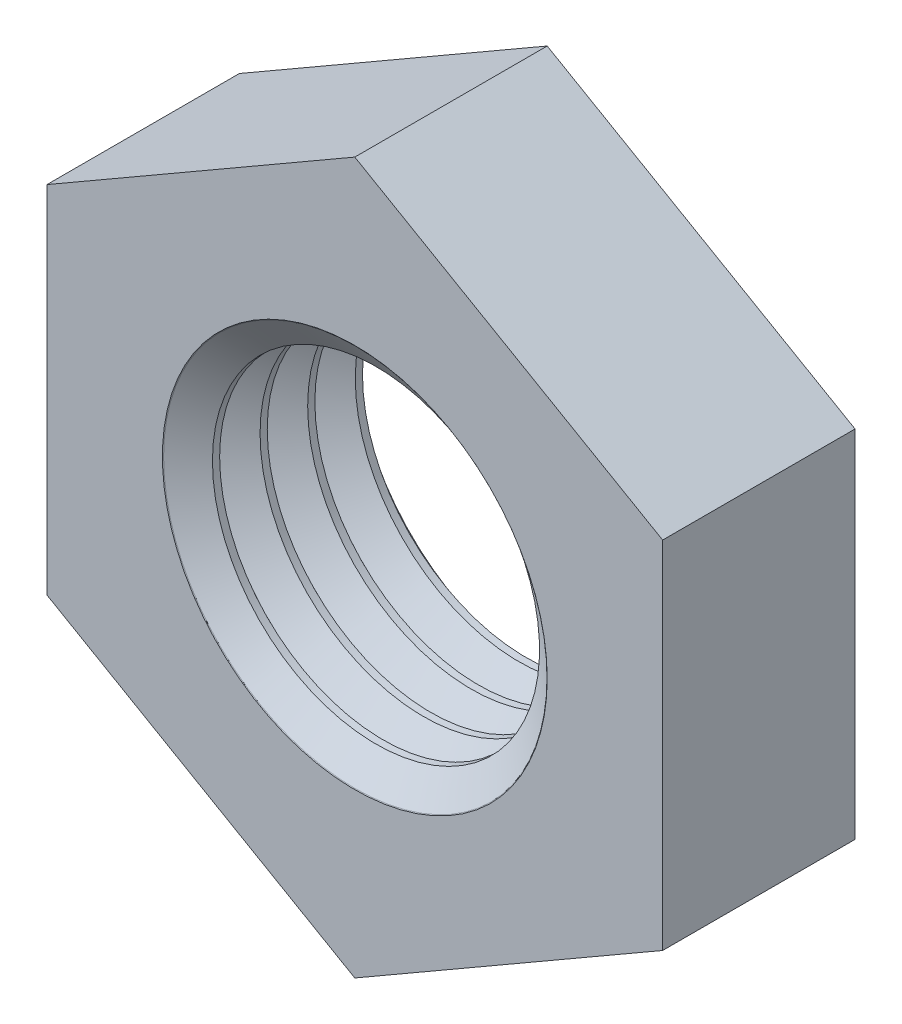
ISO-10303-21;
HEADER;
FILE_DESCRIPTION(('STEP AP214'),'2;1');
FILE_NAME('part.step','',(''),(''),'','','');
FILE_SCHEMA(('AUTOMOTIVE_DESIGN { 1 0 10303 214 1 1 1 1 }'));
ENDSEC;
DATA;
#1=APPLICATION_CONTEXT('core data for automotive mechanical design processes');
#2=APPLICATION_PROTOCOL_DEFINITION('international standard','automotive_design',2000,#1);
#3=PRODUCT_CONTEXT('',#1,'mechanical');
#4=PRODUCT('Part','Part','',(#3));
#5=PRODUCT_RELATED_PRODUCT_CATEGORY('part','',(#4));
#6=PRODUCT_DEFINITION_FORMATION('','',#4);
#7=PRODUCT_DEFINITION_CONTEXT('part definition',#1,'design');
#8=PRODUCT_DEFINITION('design','',#6,#7);
#9=PRODUCT_DEFINITION_SHAPE('','',#8);
#10=(LENGTH_UNIT() NAMED_UNIT(*) SI_UNIT(.MILLI.,.METRE.));
#11=(NAMED_UNIT(*) PLANE_ANGLE_UNIT() SI_UNIT($,.RADIAN.));
#12=(NAMED_UNIT(*) SI_UNIT($,.STERADIAN.) SOLID_ANGLE_UNIT());
#13=UNCERTAINTY_MEASURE_WITH_UNIT(LENGTH_MEASURE(1.E-05),#10,'distance_accuracy_value','');
#14=(GEOMETRIC_REPRESENTATION_CONTEXT(3) GLOBAL_UNCERTAINTY_ASSIGNED_CONTEXT((#13)) GLOBAL_UNIT_ASSIGNED_CONTEXT((#10,
#11,#12)) REPRESENTATION_CONTEXT('',''));
#15=CARTESIAN_POINT('',(0.,0.,0.));
#16=DIRECTION('',(0.,0.,1.));
#17=DIRECTION('',(1.,0.,0.));
#18=AXIS2_PLACEMENT_3D('',#15,#16,#17);
#19=CARTESIAN_POINT('',(0.,0.,-5.));
#20=DIRECTION('',(0.,0.,1.));
#21=DIRECTION('',(1.,0.,0.));
#22=AXIS2_PLACEMENT_3D('',#19,#20,#21);
#23=CYLINDRICAL_SURFACE('',#22,4.25);
#24=CARTESIAN_POINT('',(0.,0.,-4.26245565365729));
#25=DIRECTION('',(0.,0.,-1.));
#26=DIRECTION('',(-1.,0.,0.));
#27=AXIS2_PLACEMENT_3D('',#24,#25,#26);
#28=CIRCLE('',#27,4.25);
#29=CARTESIAN_POINT('',(-4.25,0.,-4.26245565365729));
#30=VERTEX_POINT('',#29);
#31=EDGE_CURVE('E226',#30,#30,#28,.T.);
#32=ORIENTED_EDGE('',*,*,#31,.F.);
#33=EDGE_LOOP('',(#32));
#34=FACE_BOUND('',#33,.T.);
#35=CARTESIAN_POINT('',(0.,0.,-4.44944434634271));
#36=DIRECTION('',(0.,0.,-1.));
#37=DIRECTION('',(-1.,0.,0.));
#38=AXIS2_PLACEMENT_3D('',#35,#36,#37);
#39=CIRCLE('',#38,4.25);
#40=CARTESIAN_POINT('',(-4.25,0.,-4.44944434634271));
#41=VERTEX_POINT('',#40);
#42=EDGE_CURVE('E154',#41,#41,#39,.F.);
#43=ORIENTED_EDGE('',*,*,#42,.F.);
#44=EDGE_LOOP('',(#43));
#45=FACE_BOUND('',#44,.T.);
#46=ADVANCED_FACE('F41',(#34,#45),#23,.F.);
#47=CARTESIAN_POINT('',(0.,0.,-3.21214434634273));
#48=DIRECTION('',(0.,0.,-1.));
#49=DIRECTION('',(-1.,0.,0.));
#50=AXIS2_PLACEMENT_3D('',#47,#48,#49);
#51=CIRCLE('',#50,4.25);
#52=CARTESIAN_POINT('',(-4.25,0.,-3.21214434634273));
#53=VERTEX_POINT('',#52);
#54=EDGE_CURVE('E233',#53,#53,#51,.T.);
#55=ORIENTED_EDGE('',*,*,#54,.T.);
#56=EDGE_LOOP('',(#55));
#57=FACE_BOUND('',#56,.T.);
#58=CARTESIAN_POINT('',(0.,0.,-3.02515565365729));
#59=DIRECTION('',(0.,0.,-1.));
#60=DIRECTION('',(-1.,0.,0.));
#61=AXIS2_PLACEMENT_3D('',#58,#59,#60);
#62=CIRCLE('',#61,4.25);
#63=CARTESIAN_POINT('',(-4.25,0.,-3.02515565365729));
#64=VERTEX_POINT('',#63);
#65=EDGE_CURVE('E220',#64,#64,#62,.T.);
#66=ORIENTED_EDGE('',*,*,#65,.F.);
#67=EDGE_LOOP('',(#66));
#68=FACE_BOUND('',#67,.T.);
#69=ADVANCED_FACE('F177',(#57,#68),#23,.F.);
#70=CARTESIAN_POINT('',(0.,0.,-1.97484434634273));
#71=DIRECTION('',(0.,0.,-1.));
#72=DIRECTION('',(-1.,0.,0.));
#73=AXIS2_PLACEMENT_3D('',#70,#71,#72);
#74=CIRCLE('',#73,4.25);
#75=CARTESIAN_POINT('',(-4.25,0.,-1.97484434634273));
#76=VERTEX_POINT('',#75);
#77=EDGE_CURVE('E225',#76,#76,#74,.T.);
#78=ORIENTED_EDGE('',*,*,#77,.T.);
#79=EDGE_LOOP('',(#78));
#80=FACE_BOUND('',#79,.T.);
#81=CARTESIAN_POINT('',(0.,0.,-1.78785565365729));
#82=DIRECTION('',(0.,0.,-1.));
#83=DIRECTION('',(-1.,0.,0.));
#84=AXIS2_PLACEMENT_3D('',#81,#82,#83);
#85=CIRCLE('',#84,4.25);
#86=CARTESIAN_POINT('',(-4.25,0.,-1.78785565365729));
#87=VERTEX_POINT('',#86);
#88=EDGE_CURVE('E208',#87,#87,#85,.T.);
#89=ORIENTED_EDGE('',*,*,#88,.F.);
#90=EDGE_LOOP('',(#89));
#91=FACE_BOUND('',#90,.T.);
#92=ADVANCED_FACE('F190',(#80,#91),#23,.F.);
#93=CARTESIAN_POINT('',(0.,0.,-0.737544346342729));
#94=DIRECTION('',(0.,0.,-1.));
#95=DIRECTION('',(-1.,0.,0.));
#96=AXIS2_PLACEMENT_3D('',#93,#94,#95);
#97=CIRCLE('',#96,4.25);
#98=CARTESIAN_POINT('',(-4.25,0.,-0.737544346342729));
#99=VERTEX_POINT('',#98);
#100=EDGE_CURVE('E196',#99,#99,#97,.T.);
#101=ORIENTED_EDGE('',*,*,#100,.T.);
#102=EDGE_LOOP('',(#101));
#103=FACE_BOUND('',#102,.T.);
#104=CARTESIAN_POINT('',(0.,0.,-0.550555653657289));
#105=DIRECTION('',(0.,0.,-1.));
#106=DIRECTION('',(-1.,0.,0.));
#107=AXIS2_PLACEMENT_3D('',#104,#105,#106);
#108=CIRCLE('',#107,4.25);
#109=CARTESIAN_POINT('',(-4.25,0.,-0.550555653657289));
#110=VERTEX_POINT('',#109);
#111=EDGE_CURVE('E202',#110,#110,#108,.T.);
#112=ORIENTED_EDGE('',*,*,#111,.F.);
#113=EDGE_LOOP('',(#112));
#114=FACE_BOUND('',#113,.T.);
#115=ADVANCED_FACE('F176',(#103,#114),#23,.F.);
#116=CARTESIAN_POINT('',(0.,9.23760430703402,-5.));
#117=DIRECTION('',(-0.500000000000001,0.866025403784438,0.));
#118=DIRECTION('',(-0.866025403784438,-0.500000000000001,0.));
#119=AXIS2_PLACEMENT_3D('',#116,#117,#118);
#120=PLANE('',#119);
#121=DIRECTION('',(-0.866025403784438,-0.500000000000001,0.));
#122=VECTOR('',#121,1.);
#123=CARTESIAN_POINT('',(0.,9.23760430703402,0.));
#124=LINE('',#123,#122);
#125=CARTESIAN_POINT('',(0.,9.23760430703402,0.));
#126=VERTEX_POINT('',#125);
#127=CARTESIAN_POINT('',(-8.,4.618802153517,0.));
#128=VERTEX_POINT('',#127);
#129=EDGE_CURVE('E127',#126,#128,#124,.T.);
#130=ORIENTED_EDGE('',*,*,#129,.F.);
#131=DIRECTION('',(0.,0.,1.));
#132=VECTOR('',#131,1.);
#133=CARTESIAN_POINT('',(0.,9.23760430703402,-5.));
#134=LINE('',#133,#132);
#135=CARTESIAN_POINT('',(0.,9.23760430703402,-5.));
#136=VERTEX_POINT('',#135);
#137=EDGE_CURVE('E11',#136,#126,#134,.T.);
#138=ORIENTED_EDGE('',*,*,#137,.F.);
#139=DIRECTION('',(-0.866025403784438,-0.500000000000001,0.));
#140=VECTOR('',#139,1.);
#141=CARTESIAN_POINT('',(0.,9.23760430703402,-5.));
#142=LINE('',#141,#140);
#143=CARTESIAN_POINT('',(-8.,4.618802153517,-5.));
#144=VERTEX_POINT('',#143);
#145=EDGE_CURVE('E141',#136,#144,#142,.T.);
#146=ORIENTED_EDGE('',*,*,#145,.T.);
#147=DIRECTION('',(0.,0.,1.));
#148=VECTOR('',#147,1.);
#149=CARTESIAN_POINT('',(-8.,4.618802153517,-5.));
#150=LINE('',#149,#148);
#151=EDGE_CURVE('E95',#144,#128,#150,.T.);
#152=ORIENTED_EDGE('',*,*,#151,.T.);
#153=EDGE_LOOP('',(#130,#138,#146,#152));
#154=FACE_BOUND('',#153,.T.);
#155=ADVANCED_FACE('F43',(#154),#120,.T.);
#156=CARTESIAN_POINT('',(8.,4.618802153517,-5.));
#157=DIRECTION('',(0.500000000000001,0.866025403784438,0.));
#158=DIRECTION('',(-0.866025403784438,0.500000000000001,0.));
#159=AXIS2_PLACEMENT_3D('',#156,#157,#158);
#160=PLANE('',#159);
#161=DIRECTION('',(-0.866025403784438,0.500000000000001,0.));
#162=VECTOR('',#161,1.);
#163=CARTESIAN_POINT('',(8.,4.618802153517,0.));
#164=LINE('',#163,#162);
#165=CARTESIAN_POINT('',(8.,4.618802153517,0.));
#166=VERTEX_POINT('',#165);
#167=EDGE_CURVE('E142',#166,#126,#164,.T.);
#168=ORIENTED_EDGE('',*,*,#167,.F.);
#169=DIRECTION('',(0.,0.,1.));
#170=VECTOR('',#169,1.);
#171=CARTESIAN_POINT('',(8.,4.618802153517,-5.));
#172=LINE('',#171,#170);
#173=CARTESIAN_POINT('',(8.,4.618802153517,-5.));
#174=VERTEX_POINT('',#173);
#175=EDGE_CURVE('E51',#174,#166,#172,.T.);
#176=ORIENTED_EDGE('',*,*,#175,.F.);
#177=DIRECTION('',(-0.866025403784438,0.500000000000001,0.));
#178=VECTOR('',#177,1.);
#179=CARTESIAN_POINT('',(8.,4.618802153517,-5.));
#180=LINE('',#179,#178);
#181=EDGE_CURVE('E109',#174,#136,#180,.T.);
#182=ORIENTED_EDGE('',*,*,#181,.T.);
#183=ORIENTED_EDGE('',*,*,#137,.T.);
#184=EDGE_LOOP('',(#168,#176,#182,#183));
#185=FACE_BOUND('',#184,.T.);
#186=ADVANCED_FACE('F166',(#185),#160,.T.);
#187=CARTESIAN_POINT('',(8.,4.618802153517,-5.));
#188=DIRECTION('',(-1.,0.,0.));
#189=DIRECTION('',(0.,0.,1.));
#190=AXIS2_PLACEMENT_3D('',#187,#188,#189);
#191=PLANE('',#190);
#192=DIRECTION('',(0.,-1.,0.));
#193=VECTOR('',#192,1.);
#194=CARTESIAN_POINT('',(8.,4.618802153517,0.));
#195=LINE('',#194,#193);
#196=CARTESIAN_POINT('',(8.,-4.61880215351702,0.));
#197=VERTEX_POINT('',#196);
#198=EDGE_CURVE('E112',#166,#197,#195,.T.);
#199=ORIENTED_EDGE('',*,*,#198,.T.);
#200=DIRECTION('',(0.,0.,1.));
#201=VECTOR('',#200,1.);
#202=CARTESIAN_POINT('',(8.,-4.61880215351702,-5.));
#203=LINE('',#202,#201);
#204=CARTESIAN_POINT('',(8.,-4.61880215351702,-5.));
#205=VERTEX_POINT('',#204);
#206=EDGE_CURVE('E115',#205,#197,#203,.T.);
#207=ORIENTED_EDGE('',*,*,#206,.F.);
#208=DIRECTION('',(0.,-1.,0.));
#209=VECTOR('',#208,1.);
#210=CARTESIAN_POINT('',(8.,4.618802153517,-5.));
#211=LINE('',#210,#209);
#212=EDGE_CURVE('E101',#174,#205,#211,.T.);
#213=ORIENTED_EDGE('',*,*,#212,.F.);
#214=ORIENTED_EDGE('',*,*,#175,.T.);
#215=EDGE_LOOP('',(#199,#207,#213,#214));
#216=FACE_BOUND('',#215,.T.);
#217=ADVANCED_FACE('F113',(#216),#191,.F.);
#218=CARTESIAN_POINT('',(0.,-9.23760430703404,-5.));
#219=DIRECTION('',(0.500000000000001,-0.866025403784438,0.));
#220=DIRECTION('',(0.866025403784438,0.500000000000001,0.));
#221=AXIS2_PLACEMENT_3D('',#218,#219,#220);
#222=PLANE('',#221);
#223=DIRECTION('',(0.866025403784438,0.500000000000001,0.));
#224=VECTOR('',#223,1.);
#225=CARTESIAN_POINT('',(0.,-9.23760430703404,0.));
#226=LINE('',#225,#224);
#227=CARTESIAN_POINT('',(0.,-9.23760430703404,0.));
#228=VERTEX_POINT('',#227);
#229=EDGE_CURVE('E137',#228,#197,#226,.T.);
#230=ORIENTED_EDGE('',*,*,#229,.F.);
#231=DIRECTION('',(0.,0.,1.));
#232=VECTOR('',#231,1.);
#233=CARTESIAN_POINT('',(0.,-9.23760430703404,-5.));
#234=LINE('',#233,#232);
#235=CARTESIAN_POINT('',(0.,-9.23760430703404,-5.));
#236=VERTEX_POINT('',#235);
#237=EDGE_CURVE('E117',#236,#228,#234,.T.);
#238=ORIENTED_EDGE('',*,*,#237,.F.);
#239=DIRECTION('',(0.866025403784438,0.500000000000001,0.));
#240=VECTOR('',#239,1.);
#241=CARTESIAN_POINT('',(0.,-9.23760430703404,-5.));
#242=LINE('',#241,#240);
#243=EDGE_CURVE('E108',#236,#205,#242,.T.);
#244=ORIENTED_EDGE('',*,*,#243,.T.);
#245=ORIENTED_EDGE('',*,*,#206,.T.);
#246=EDGE_LOOP('',(#230,#238,#244,#245));
#247=FACE_BOUND('',#246,.T.);
#248=ADVANCED_FACE('F119',(#247),#222,.T.);
#249=CARTESIAN_POINT('',(-8.,-4.61880215351702,-5.));
#250=DIRECTION('',(-0.500000000000001,-0.866025403784438,0.));
#251=DIRECTION('',(0.866025403784438,-0.500000000000001,0.));
#252=AXIS2_PLACEMENT_3D('',#249,#250,#251);
#253=PLANE('',#252);
#254=DIRECTION('',(0.866025403784438,-0.500000000000001,0.));
#255=VECTOR('',#254,1.);
#256=CARTESIAN_POINT('',(-8.,-4.61880215351702,0.));
#257=LINE('',#256,#255);
#258=CARTESIAN_POINT('',(-8.,-4.61880215351702,0.));
#259=VERTEX_POINT('',#258);
#260=EDGE_CURVE('E131',#259,#228,#257,.T.);
#261=ORIENTED_EDGE('',*,*,#260,.F.);
#262=DIRECTION('',(0.,0.,1.));
#263=VECTOR('',#262,1.);
#264=CARTESIAN_POINT('',(-8.,-4.61880215351702,-5.));
#265=LINE('',#264,#263);
#266=CARTESIAN_POINT('',(-8.,-4.61880215351702,-5.));
#267=VERTEX_POINT('',#266);
#268=EDGE_CURVE('E150',#267,#259,#265,.T.);
#269=ORIENTED_EDGE('',*,*,#268,.F.);
#270=DIRECTION('',(0.866025403784438,-0.500000000000001,0.));
#271=VECTOR('',#270,1.);
#272=CARTESIAN_POINT('',(-8.,-4.61880215351702,-5.));
#273=LINE('',#272,#271);
#274=EDGE_CURVE('E122',#267,#236,#273,.T.);
#275=ORIENTED_EDGE('',*,*,#274,.T.);
#276=ORIENTED_EDGE('',*,*,#237,.T.);
#277=EDGE_LOOP('',(#261,#269,#275,#276));
#278=FACE_BOUND('',#277,.T.);
#279=ADVANCED_FACE('F296',(#278),#253,.T.);
#280=CARTESIAN_POINT('',(-8.,4.618802153517,-5.));
#281=DIRECTION('',(-1.,0.,0.));
#282=DIRECTION('',(0.,0.,1.));
#283=AXIS2_PLACEMENT_3D('',#280,#281,#282);
#284=PLANE('',#283);
#285=DIRECTION('',(0.,-1.,0.));
#286=VECTOR('',#285,1.);
#287=CARTESIAN_POINT('',(-8.,4.618802153517,0.));
#288=LINE('',#287,#286);
#289=EDGE_CURVE('E133',#128,#259,#288,.T.);
#290=ORIENTED_EDGE('',*,*,#289,.F.);
#291=ORIENTED_EDGE('',*,*,#151,.F.);
#292=DIRECTION('',(0.,-1.,0.));
#293=VECTOR('',#292,1.);
#294=CARTESIAN_POINT('',(-8.,4.618802153517,-5.));
#295=LINE('',#294,#293);
#296=EDGE_CURVE('E124',#144,#267,#295,.T.);
#297=ORIENTED_EDGE('',*,*,#296,.T.);
#298=ORIENTED_EDGE('',*,*,#268,.T.);
#299=EDGE_LOOP('',(#290,#291,#297,#298));
#300=FACE_BOUND('',#299,.T.);
#301=ADVANCED_FACE('F165',(#300),#284,.T.);
#302=CARTESIAN_POINT('',(-16.,0.,-5.));
#303=DIRECTION('',(0.,0.,1.));
#304=DIRECTION('',(1.,0.,0.));
#305=AXIS2_PLACEMENT_3D('',#302,#303,#304);
#306=PLANE('',#305);
#307=CARTESIAN_POINT('',(0.,0.,-5.));
#308=DIRECTION('',(0.,0.,1.));
#309=DIRECTION('',(1.,0.,0.));
#310=AXIS2_PLACEMENT_3D('',#307,#308,#309);
#311=CIRCLE('',#310,5.);
#312=CARTESIAN_POINT('',(5.,0.,-5.));
#313=VERTEX_POINT('',#312);
#314=EDGE_CURVE('E149',#313,#313,#311,.F.);
#315=ORIENTED_EDGE('',*,*,#314,.F.);
#316=EDGE_LOOP('',(#315));
#317=FACE_BOUND('',#316,.T.);
#318=ORIENTED_EDGE('',*,*,#145,.F.);
#319=ORIENTED_EDGE('',*,*,#181,.F.);
#320=ORIENTED_EDGE('',*,*,#212,.T.);
#321=ORIENTED_EDGE('',*,*,#243,.F.);
#322=ORIENTED_EDGE('',*,*,#274,.F.);
#323=ORIENTED_EDGE('',*,*,#296,.F.);
#324=EDGE_LOOP('',(#318,#319,#320,#321,#322,#323));
#325=FACE_BOUND('',#324,.T.);
#326=ADVANCED_FACE('F102',(#317,#325),#306,.F.);
#327=CARTESIAN_POINT('',(-16.,0.,0.));
#328=DIRECTION('',(0.,0.,1.));
#329=DIRECTION('',(1.,0.,0.));
#330=AXIS2_PLACEMENT_3D('',#327,#328,#329);
#331=PLANE('',#330);
#332=CARTESIAN_POINT('',(0.,0.,0.));
#333=DIRECTION('',(0.,0.,1.));
#334=DIRECTION('',(1.,0.,0.));
#335=AXIS2_PLACEMENT_3D('',#332,#333,#334);
#336=CIRCLE('',#335,5.);
#337=CARTESIAN_POINT('',(5.,0.,0.));
#338=VERTEX_POINT('',#337);
#339=EDGE_CURVE('E134',#338,#338,#336,.T.);
#340=ORIENTED_EDGE('',*,*,#339,.F.);
#341=EDGE_LOOP('',(#340));
#342=FACE_BOUND('',#341,.T.);
#343=ORIENTED_EDGE('',*,*,#129,.T.);
#344=ORIENTED_EDGE('',*,*,#289,.T.);
#345=ORIENTED_EDGE('',*,*,#260,.T.);
#346=ORIENTED_EDGE('',*,*,#229,.T.);
#347=ORIENTED_EDGE('',*,*,#198,.F.);
#348=ORIENTED_EDGE('',*,*,#167,.T.);
#349=EDGE_LOOP('',(#343,#344,#345,#346,#347,#348));
#350=FACE_BOUND('',#349,.T.);
#351=ADVANCED_FACE('F170',(#342,#350),#331,.T.);
#352=CARTESIAN_POINT('',(0.,0.,-0.577671219023013));
#353=DIRECTION('',(0.,0.,1.));
#354=DIRECTION('',(1.,0.,0.));
#355=AXIS2_PLACEMENT_3D('',#352,#353,#354);
#356=CONICAL_SURFACE('',#355,4.175,0.959931088596879);
#357=CARTESIAN_POINT('',(0.,0.,-0.0127000000000009));
#358=DIRECTION('',(0.,0.,-1.));
#359=DIRECTION('',(-1.,0.,0.));
#360=AXIS2_PLACEMENT_3D('',#357,#358,#359);
#361=CIRCLE('',#360,4.98186252031437);
#362=CARTESIAN_POINT('',(-4.98186252031437,0.,-0.0127000000000009));
#363=VERTEX_POINT('',#362);
#364=EDGE_CURVE('E44',#363,#363,#361,.F.);
#365=ORIENTED_EDGE('',*,*,#364,.F.);
#366=EDGE_LOOP('',(#365));
#367=FACE_BOUND('',#366,.T.);
#368=ORIENTED_EDGE('',*,*,#339,.T.);
#369=EDGE_LOOP('',(#368));
#370=FACE_BOUND('',#369,.T.);
#371=ADVANCED_FACE('F280',(#367,#370),#356,.F.);
#372=CARTESIAN_POINT('',(0.,0.,-4.9746));
#373=DIRECTION('',(0.,0.,-1.));
#374=DIRECTION('',(-1.,0.,0.));
#375=AXIS2_PLACEMENT_3D('',#372,#373,#374);
#376=CONICAL_SURFACE('',#375,5.,0.95993108859688);
#377=CARTESIAN_POINT('',(0.,0.,-4.9746));
#378=DIRECTION('',(0.,0.,1.));
#379=DIRECTION('',(1.,0.,0.));
#380=AXIS2_PLACEMENT_3D('',#377,#378,#379);
#381=CIRCLE('',#380,5.);
#382=CARTESIAN_POINT('',(5.,0.,-4.9746));
#383=VERTEX_POINT('',#382);
#384=EDGE_CURVE('E152',#383,#383,#381,.T.);
#385=ORIENTED_EDGE('',*,*,#384,.F.);
#386=EDGE_LOOP('',(#385));
#387=FACE_BOUND('',#386,.T.);
#388=ORIENTED_EDGE('',*,*,#42,.T.);
#389=EDGE_LOOP('',(#388));
#390=FACE_BOUND('',#389,.T.);
#391=ADVANCED_FACE('F274',(#387,#390),#376,.F.);
#392=CARTESIAN_POINT('',(0.,0.,-25.0375057290932));
#393=DIRECTION('',(0.,0.,1.));
#394=DIRECTION('',(1.,0.,0.));
#395=AXIS2_PLACEMENT_3D('',#392,#393,#394);
#396=CYLINDRICAL_SURFACE('',#395,5.);
#397=ORIENTED_EDGE('',*,*,#384,.T.);
#398=EDGE_LOOP('',(#397));
#399=FACE_BOUND('',#398,.T.);
#400=ORIENTED_EDGE('',*,*,#314,.T.);
#401=EDGE_LOOP('',(#400));
#402=FACE_BOUND('',#401,.T.);
#403=ADVANCED_FACE('F275',(#399,#402),#396,.F.);
#404=CARTESIAN_POINT('',(0.,0.,-0.0254000000000001));
#405=DIRECTION('',(0.,0.,-1.));
#406=DIRECTION('',(-1.,0.,0.));
#407=AXIS2_PLACEMENT_3D('',#404,#405,#406);
#408=CONICAL_SURFACE('',#407,5.,0.959931088596891);
#409=ORIENTED_EDGE('',*,*,#364,.T.);
#410=EDGE_LOOP('',(#409));
#411=FACE_BOUND('',#410,.T.);
#412=CARTESIAN_POINT('',(0.,0.,-0.0254000000000001));
#413=DIRECTION('',(0.,0.,-1.));
#414=DIRECTION('',(-1.,0.,0.));
#415=AXIS2_PLACEMENT_3D('',#412,#413,#414);
#416=CIRCLE('',#415,5.);
#417=CARTESIAN_POINT('',(-5.,0.,-0.0254000000000001));
#418=VERTEX_POINT('',#417);
#419=EDGE_CURVE('E204',#418,#418,#416,.T.);
#420=ORIENTED_EDGE('',*,*,#419,.T.);
#421=EDGE_LOOP('',(#420));
#422=FACE_BOUND('',#421,.T.);
#423=ADVANCED_FACE('F267',(#411,#422),#408,.F.);
#424=CARTESIAN_POINT('',(0.,0.,-0.550555653657289));
#425=DIRECTION('',(0.,0.,1.));
#426=DIRECTION('',(1.,0.,0.));
#427=AXIS2_PLACEMENT_3D('',#424,#425,#426);
#428=CONICAL_SURFACE('',#427,4.25,0.959931088596876);
#429=ORIENTED_EDGE('',*,*,#419,.F.);
#430=EDGE_LOOP('',(#429));
#431=FACE_BOUND('',#430,.T.);
#432=ORIENTED_EDGE('',*,*,#111,.T.);
#433=EDGE_LOOP('',(#432));
#434=FACE_BOUND('',#433,.T.);
#435=ADVANCED_FACE('F265',(#431,#434),#428,.F.);
#436=CARTESIAN_POINT('',(0.,0.,-1.2627));
#437=DIRECTION('',(0.,0.,-1.));
#438=DIRECTION('',(-1.,0.,0.));
#439=AXIS2_PLACEMENT_3D('',#436,#437,#438);
#440=CONICAL_SURFACE('',#439,5.,0.959931088596891);
#441=ORIENTED_EDGE('',*,*,#100,.F.);
#442=EDGE_LOOP('',(#441));
#443=FACE_BOUND('',#442,.T.);
#444=CARTESIAN_POINT('',(0.,0.,-1.2627));
#445=DIRECTION('',(0.,0.,-1.));
#446=DIRECTION('',(-1.,0.,0.));
#447=AXIS2_PLACEMENT_3D('',#444,#445,#446);
#448=CIRCLE('',#447,5.);
#449=CARTESIAN_POINT('',(-5.,0.,-1.2627));
#450=VERTEX_POINT('',#449);
#451=EDGE_CURVE('E207',#450,#450,#448,.T.);
#452=ORIENTED_EDGE('',*,*,#451,.T.);
#453=EDGE_LOOP('',(#452));
#454=FACE_BOUND('',#453,.T.);
#455=ADVANCED_FACE('F259',(#443,#454),#440,.F.);
#456=CARTESIAN_POINT('',(0.,0.,-1.78785565365729));
#457=DIRECTION('',(0.,0.,1.));
#458=DIRECTION('',(1.,0.,0.));
#459=AXIS2_PLACEMENT_3D('',#456,#457,#458);
#460=CONICAL_SURFACE('',#459,4.25,0.959931088596876);
#461=ORIENTED_EDGE('',*,*,#451,.F.);
#462=EDGE_LOOP('',(#461));
#463=FACE_BOUND('',#462,.T.);
#464=ORIENTED_EDGE('',*,*,#88,.T.);
#465=EDGE_LOOP('',(#464));
#466=FACE_BOUND('',#465,.T.);
#467=ADVANCED_FACE('F256',(#463,#466),#460,.F.);
#468=CARTESIAN_POINT('',(0.,0.,-2.5));
#469=DIRECTION('',(0.,0.,-1.));
#470=DIRECTION('',(-1.,0.,0.));
#471=AXIS2_PLACEMENT_3D('',#468,#469,#470);
#472=CONICAL_SURFACE('',#471,5.,0.959931088596891);
#473=ORIENTED_EDGE('',*,*,#77,.F.);
#474=EDGE_LOOP('',(#473));
#475=FACE_BOUND('',#474,.T.);
#476=CARTESIAN_POINT('',(0.,0.,-2.5));
#477=DIRECTION('',(0.,0.,-1.));
#478=DIRECTION('',(-1.,0.,0.));
#479=AXIS2_PLACEMENT_3D('',#476,#477,#478);
#480=CIRCLE('',#479,5.);
#481=CARTESIAN_POINT('',(-5.,0.,-2.5));
#482=VERTEX_POINT('',#481);
#483=EDGE_CURVE('E218',#482,#482,#480,.T.);
#484=ORIENTED_EDGE('',*,*,#483,.T.);
#485=EDGE_LOOP('',(#484));
#486=FACE_BOUND('',#485,.T.);
#487=ADVANCED_FACE('F255',(#475,#486),#472,.F.);
#488=CARTESIAN_POINT('',(0.,0.,-3.02515565365729));
#489=DIRECTION('',(0.,0.,1.));
#490=DIRECTION('',(1.,0.,0.));
#491=AXIS2_PLACEMENT_3D('',#488,#489,#490);
#492=CONICAL_SURFACE('',#491,4.25,0.959931088596876);
#493=ORIENTED_EDGE('',*,*,#483,.F.);
#494=EDGE_LOOP('',(#493));
#495=FACE_BOUND('',#494,.T.);
#496=ORIENTED_EDGE('',*,*,#65,.T.);
#497=EDGE_LOOP('',(#496));
#498=FACE_BOUND('',#497,.T.);
#499=ADVANCED_FACE('F239',(#495,#498),#492,.F.);
#500=CARTESIAN_POINT('',(0.,0.,-3.7373));
#501=DIRECTION('',(0.,0.,-1.));
#502=DIRECTION('',(-1.,0.,0.));
#503=AXIS2_PLACEMENT_3D('',#500,#501,#502);
#504=CONICAL_SURFACE('',#503,5.,0.959931088596891);
#505=ORIENTED_EDGE('',*,*,#54,.F.);
#506=EDGE_LOOP('',(#505));
#507=FACE_BOUND('',#506,.T.);
#508=CARTESIAN_POINT('',(0.,0.,-3.7373));
#509=DIRECTION('',(0.,0.,-1.));
#510=DIRECTION('',(-1.,0.,0.));
#511=AXIS2_PLACEMENT_3D('',#508,#509,#510);
#512=CIRCLE('',#511,5.);
#513=CARTESIAN_POINT('',(-5.,0.,-3.7373));
#514=VERTEX_POINT('',#513);
#515=EDGE_CURVE('E224',#514,#514,#512,.T.);
#516=ORIENTED_EDGE('',*,*,#515,.T.);
#517=EDGE_LOOP('',(#516));
#518=FACE_BOUND('',#517,.T.);
#519=ADVANCED_FACE('F236',(#507,#518),#504,.F.);
#520=CARTESIAN_POINT('',(0.,0.,-4.26245565365729));
#521=DIRECTION('',(0.,0.,1.));
#522=DIRECTION('',(1.,0.,0.));
#523=AXIS2_PLACEMENT_3D('',#520,#521,#522);
#524=CONICAL_SURFACE('',#523,4.25,0.959931088596876);
#525=ORIENTED_EDGE('',*,*,#515,.F.);
#526=EDGE_LOOP('',(#525));
#527=FACE_BOUND('',#526,.T.);
#528=ORIENTED_EDGE('',*,*,#31,.T.);
#529=EDGE_LOOP('',(#528));
#530=FACE_BOUND('',#529,.T.);
#531=ADVANCED_FACE('F237',(#527,#530),#524,.F.);
#532=CLOSED_SHELL('',(#46,#69,#92,#115,#155,#186,#217,#248,#279,#301,#326,#351,#371,#391,#403,
#423,#435,#455,#467,#487,#499,#519,#531));
#533=MANIFOLD_SOLID_BREP('B2',#532);
#534=ADVANCED_BREP_SHAPE_REPRESENTATION('',(#18,#533),#14);
#535=SHAPE_DEFINITION_REPRESENTATION(#9,#534);
ENDSEC;
END-ISO-10303-21;
